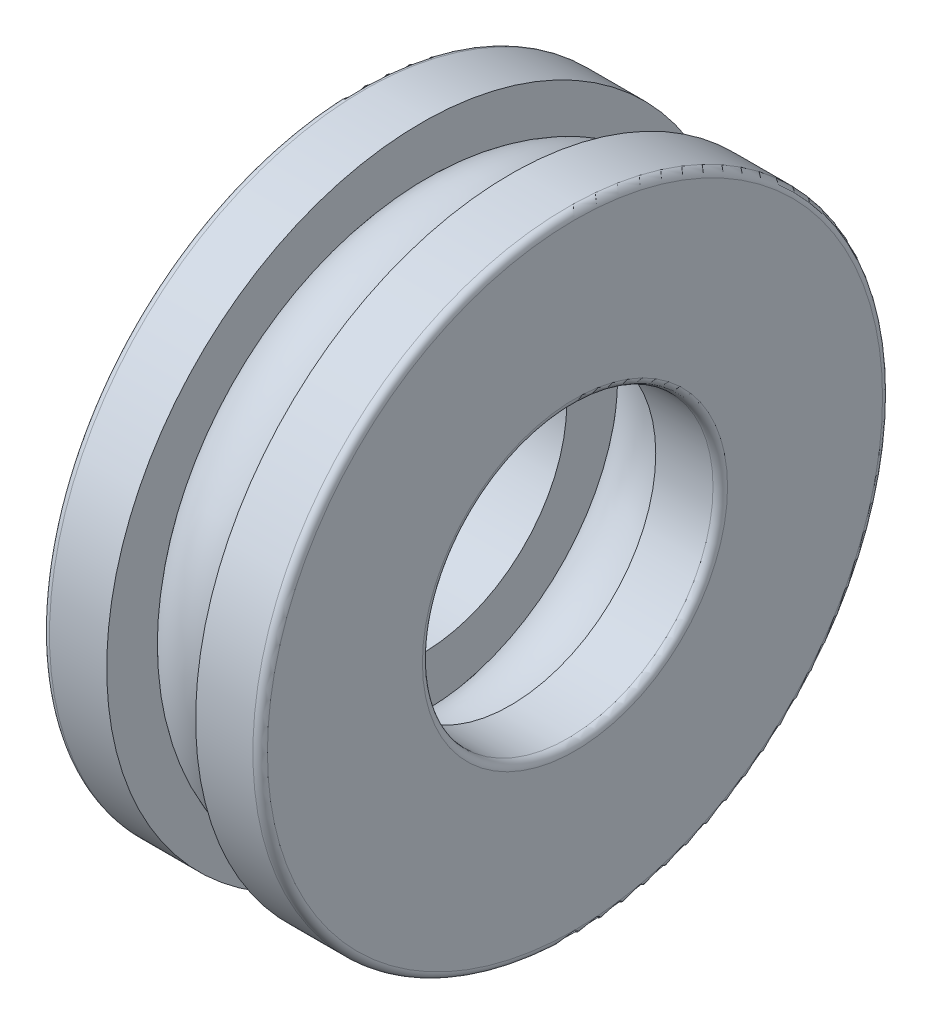
ISO-10303-21;
HEADER;
FILE_DESCRIPTION(('STEP AP214'),'2;1');
FILE_NAME('part.step','',(''),(''),'','','');
FILE_SCHEMA(('AUTOMOTIVE_DESIGN { 1 0 10303 214 1 1 1 1 }'));
ENDSEC;
DATA;
#1=APPLICATION_CONTEXT('core data for automotive mechanical design processes');
#2=APPLICATION_PROTOCOL_DEFINITION('international standard','automotive_design',2000,#1);
#3=PRODUCT_CONTEXT('',#1,'mechanical');
#4=PRODUCT('Part','Part','',(#3));
#5=PRODUCT_RELATED_PRODUCT_CATEGORY('part','',(#4));
#6=PRODUCT_DEFINITION_FORMATION('','',#4);
#7=PRODUCT_DEFINITION_CONTEXT('part definition',#1,'design');
#8=PRODUCT_DEFINITION('design','',#6,#7);
#9=PRODUCT_DEFINITION_SHAPE('','',#8);
#10=(LENGTH_UNIT() NAMED_UNIT(*) SI_UNIT(.MILLI.,.METRE.));
#11=(NAMED_UNIT(*) PLANE_ANGLE_UNIT() SI_UNIT($,.RADIAN.));
#12=(NAMED_UNIT(*) SI_UNIT($,.STERADIAN.) SOLID_ANGLE_UNIT());
#13=UNCERTAINTY_MEASURE_WITH_UNIT(LENGTH_MEASURE(1.E-05),#10,'distance_accuracy_value','');
#14=(GEOMETRIC_REPRESENTATION_CONTEXT(3) GLOBAL_UNCERTAINTY_ASSIGNED_CONTEXT((#13)) GLOBAL_UNIT_ASSIGNED_CONTEXT((#10,
#11,#12)) REPRESENTATION_CONTEXT('',''));
#15=CARTESIAN_POINT('',(0.,0.,0.));
#16=DIRECTION('',(0.,0.,1.));
#17=DIRECTION('',(1.,0.,0.));
#18=AXIS2_PLACEMENT_3D('',#15,#16,#17);
#19=CARTESIAN_POINT('',(0.,0.,0.));
#20=DIRECTION('',(-1.,0.,0.));
#21=DIRECTION('',(0.,0.,1.));
#22=AXIS2_PLACEMENT_3D('',#19,#20,#21);
#23=TOROIDAL_SURFACE('',#22,9.5,2.295);
#24=CARTESIAN_POINT('',(1.836,0.,0.));
#25=DIRECTION('',(-1.,0.,0.));
#26=DIRECTION('',(0.,0.,1.));
#27=AXIS2_PLACEMENT_3D('',#24,#25,#26);
#28=CIRCLE('',#27,10.877);
#29=CARTESIAN_POINT('',(1.836,0.,10.877));
#30=VERTEX_POINT('',#29);
#31=EDGE_CURVE('E36',#30,#30,#28,.T.);
#32=ORIENTED_EDGE('',*,*,#31,.T.);
#33=EDGE_LOOP('',(#32));
#34=FACE_BOUND('',#33,.T.);
#35=CARTESIAN_POINT('',(-1.836,0.,0.));
#36=DIRECTION('',(1.,0.,0.));
#37=DIRECTION('',(0.,0.,-1.));
#38=AXIS2_PLACEMENT_3D('',#35,#36,#37);
#39=CIRCLE('',#38,10.877);
#40=CARTESIAN_POINT('',(-1.836,0.,-10.877));
#41=VERTEX_POINT('',#40);
#42=EDGE_CURVE('E51',#41,#41,#39,.F.);
#43=ORIENTED_EDGE('',*,*,#42,.F.);
#44=EDGE_LOOP('',(#43));
#45=FACE_BOUND('',#44,.T.);
#46=ADVANCED_FACE('F32',(#34,#45),#23,.T.);
#47=CARTESIAN_POINT('',(-1.836,8.16508277410171,0.));
#48=DIRECTION('',(1.,0.,0.));
#49=DIRECTION('',(0.,0.,-1.));
#50=AXIS2_PLACEMENT_3D('',#47,#48,#49);
#51=PLANE('',#50);
#52=CARTESIAN_POINT('',(-1.836,0.,0.));
#53=DIRECTION('',(1.,0.,0.));
#54=DIRECTION('',(0.,0.,-1.));
#55=AXIS2_PLACEMENT_3D('',#52,#53,#54);
#56=CIRCLE('',#55,6.);
#57=CARTESIAN_POINT('',(-1.836,0.,-6.));
#58=VERTEX_POINT('',#57);
#59=EDGE_CURVE('E70',#58,#58,#56,.T.);
#60=ORIENTED_EDGE('',*,*,#59,.F.);
#61=EDGE_LOOP('',(#60));
#62=FACE_BOUND('',#61,.T.);
#63=CARTESIAN_POINT('',(-1.836,0.,0.));
#64=DIRECTION('',(-1.,0.,0.));
#65=DIRECTION('',(0.,0.,1.));
#66=AXIS2_PLACEMENT_3D('',#63,#64,#65);
#67=CIRCLE('',#66,8.123);
#68=CARTESIAN_POINT('',(-1.836,0.,8.123));
#69=VERTEX_POINT('',#68);
#70=EDGE_CURVE('E49',#69,#69,#67,.F.);
#71=ORIENTED_EDGE('',*,*,#70,.T.);
#72=EDGE_LOOP('',(#71));
#73=FACE_BOUND('',#72,.T.);
#74=ADVANCED_FACE('F99',(#62,#73),#51,.T.);
#75=CARTESIAN_POINT('',(-1.836,13.,0.));
#76=DIRECTION('',(1.,0.,0.));
#77=DIRECTION('',(0.,0.,-1.));
#78=AXIS2_PLACEMENT_3D('',#75,#76,#77);
#79=PLANE('',#78);
#80=ORIENTED_EDGE('',*,*,#42,.T.);
#81=EDGE_LOOP('',(#80));
#82=FACE_BOUND('',#81,.T.);
#83=CARTESIAN_POINT('',(-1.836,0.,0.));
#84=DIRECTION('',(1.,0.,0.));
#85=DIRECTION('',(0.,0.,-1.));
#86=AXIS2_PLACEMENT_3D('',#83,#84,#85);
#87=CIRCLE('',#86,13.);
#88=CARTESIAN_POINT('',(-1.836,0.,-13.));
#89=VERTEX_POINT('',#88);
#90=EDGE_CURVE('E10',#89,#89,#87,.T.);
#91=ORIENTED_EDGE('',*,*,#90,.T.);
#92=EDGE_LOOP('',(#91));
#93=FACE_BOUND('',#92,.T.);
#94=ADVANCED_FACE('F34',(#82,#93),#79,.T.);
#95=CARTESIAN_POINT('',(-34.925,0.,0.));
#96=DIRECTION('',(1.,0.,0.));
#97=DIRECTION('',(0.,0.,-1.));
#98=AXIS2_PLACEMENT_3D('',#95,#96,#97);
#99=CYLINDRICAL_SURFACE('',#98,13.);
#100=CARTESIAN_POINT('',(-4.2,0.,0.));
#101=DIRECTION('',(1.,0.,0.));
#102=DIRECTION('',(0.,0.,-1.));
#103=AXIS2_PLACEMENT_3D('',#100,#101,#102);
#104=CIRCLE('',#103,13.);
#105=CARTESIAN_POINT('',(-4.2,0.,-13.));
#106=VERTEX_POINT('',#105);
#107=EDGE_CURVE('E40',#106,#106,#104,.T.);
#108=ORIENTED_EDGE('',*,*,#107,.T.);
#109=EDGE_LOOP('',(#108));
#110=FACE_BOUND('',#109,.T.);
#111=ORIENTED_EDGE('',*,*,#90,.F.);
#112=EDGE_LOOP('',(#111));
#113=FACE_BOUND('',#112,.T.);
#114=ADVANCED_FACE('F96',(#110,#113),#99,.T.);
#115=CARTESIAN_POINT('',(-4.2,0.,0.));
#116=DIRECTION('',(1.,0.,0.));
#117=DIRECTION('',(0.,0.,-1.));
#118=AXIS2_PLACEMENT_3D('',#115,#116,#117);
#119=TOROIDAL_SURFACE('',#118,12.7,0.300000000000001);
#120=CARTESIAN_POINT('',(-4.5,0.,0.));
#121=DIRECTION('',(1.,0.,0.));
#122=DIRECTION('',(0.,0.,-1.));
#123=AXIS2_PLACEMENT_3D('',#120,#121,#122);
#124=CIRCLE('',#123,12.7);
#125=CARTESIAN_POINT('',(-4.5,0.,-12.7));
#126=VERTEX_POINT('',#125);
#127=EDGE_CURVE('E45',#126,#126,#124,.T.);
#128=ORIENTED_EDGE('',*,*,#127,.T.);
#129=EDGE_LOOP('',(#128));
#130=FACE_BOUND('',#129,.T.);
#131=ORIENTED_EDGE('',*,*,#107,.F.);
#132=EDGE_LOOP('',(#131));
#133=FACE_BOUND('',#132,.T.);
#134=ADVANCED_FACE('F81',(#130,#133),#119,.T.);
#135=CARTESIAN_POINT('',(-4.5,6.3,0.));
#136=DIRECTION('',(-1.,0.,0.));
#137=DIRECTION('',(0.,0.,1.));
#138=AXIS2_PLACEMENT_3D('',#135,#136,#137);
#139=PLANE('',#138);
#140=CARTESIAN_POINT('',(-4.5,0.,0.));
#141=DIRECTION('',(1.,0.,0.));
#142=DIRECTION('',(0.,0.,-1.));
#143=AXIS2_PLACEMENT_3D('',#140,#141,#142);
#144=CIRCLE('',#143,6.3);
#145=CARTESIAN_POINT('',(-4.5,0.,-6.3));
#146=VERTEX_POINT('',#145);
#147=EDGE_CURVE('E76',#146,#146,#144,.T.);
#148=ORIENTED_EDGE('',*,*,#147,.T.);
#149=EDGE_LOOP('',(#148));
#150=FACE_BOUND('',#149,.T.);
#151=ORIENTED_EDGE('',*,*,#127,.F.);
#152=EDGE_LOOP('',(#151));
#153=FACE_BOUND('',#152,.T.);
#154=ADVANCED_FACE('F84',(#150,#153),#139,.T.);
#155=CARTESIAN_POINT('',(-4.2,0.,0.));
#156=DIRECTION('',(1.,0.,0.));
#157=DIRECTION('',(0.,0.,-1.));
#158=AXIS2_PLACEMENT_3D('',#155,#156,#157);
#159=TOROIDAL_SURFACE('',#158,6.3,0.3);
#160=CARTESIAN_POINT('',(-4.2,0.,0.));
#161=DIRECTION('',(1.,0.,0.));
#162=DIRECTION('',(0.,0.,-1.));
#163=AXIS2_PLACEMENT_3D('',#160,#161,#162);
#164=CIRCLE('',#163,6.);
#165=CARTESIAN_POINT('',(-4.2,0.,-6.));
#166=VERTEX_POINT('',#165);
#167=EDGE_CURVE('E73',#166,#166,#164,.T.);
#168=ORIENTED_EDGE('',*,*,#167,.T.);
#169=EDGE_LOOP('',(#168));
#170=FACE_BOUND('',#169,.T.);
#171=ORIENTED_EDGE('',*,*,#147,.F.);
#172=EDGE_LOOP('',(#171));
#173=FACE_BOUND('',#172,.T.);
#174=ADVANCED_FACE('F86',(#170,#173),#159,.T.);
#175=CARTESIAN_POINT('',(-34.925,0.,0.));
#176=DIRECTION('',(1.,0.,0.));
#177=DIRECTION('',(0.,0.,-1.));
#178=AXIS2_PLACEMENT_3D('',#175,#176,#177);
#179=CYLINDRICAL_SURFACE('',#178,6.);
#180=ORIENTED_EDGE('',*,*,#59,.T.);
#181=EDGE_LOOP('',(#180));
#182=FACE_BOUND('',#181,.T.);
#183=ORIENTED_EDGE('',*,*,#167,.F.);
#184=EDGE_LOOP('',(#183));
#185=FACE_BOUND('',#184,.T.);
#186=ADVANCED_FACE('F93',(#182,#185),#179,.F.);
#187=CARTESIAN_POINT('',(1.836,0.,0.));
#188=DIRECTION('',(1.,0.,0.));
#189=DIRECTION('',(0.,0.,-1.));
#190=AXIS2_PLACEMENT_3D('',#187,#188,#189);
#191=CIRCLE('',#190,8.123);
#192=CARTESIAN_POINT('',(1.836,0.,-8.123));
#193=VERTEX_POINT('',#192);
#194=EDGE_CURVE('E52',#193,#193,#191,.T.);
#195=ORIENTED_EDGE('',*,*,#194,.T.);
#196=EDGE_LOOP('',(#195));
#197=FACE_BOUND('',#196,.T.);
#198=ORIENTED_EDGE('',*,*,#70,.F.);
#199=EDGE_LOOP('',(#198));
#200=FACE_BOUND('',#199,.T.);
#201=ADVANCED_FACE('F102',(#197,#200),#23,.T.);
#202=CARTESIAN_POINT('',(1.836,8.16508277410171,0.));
#203=DIRECTION('',(-1.,0.,0.));
#204=DIRECTION('',(0.,0.,-1.));
#205=AXIS2_PLACEMENT_3D('',#202,#203,#204);
#206=PLANE('',#205);
#207=CARTESIAN_POINT('',(1.836,0.,0.));
#208=DIRECTION('',(1.,0.,0.));
#209=DIRECTION('',(0.,0.,-1.));
#210=AXIS2_PLACEMENT_3D('',#207,#208,#209);
#211=CIRCLE('',#210,6.);
#212=CARTESIAN_POINT('',(1.836,0.,-6.));
#213=VERTEX_POINT('',#212);
#214=EDGE_CURVE('E246',#213,#213,#211,.T.);
#215=ORIENTED_EDGE('',*,*,#214,.T.);
#216=EDGE_LOOP('',(#215));
#217=FACE_BOUND('',#216,.T.);
#218=ORIENTED_EDGE('',*,*,#194,.F.);
#219=EDGE_LOOP('',(#218));
#220=FACE_BOUND('',#219,.T.);
#221=ADVANCED_FACE('F111',(#217,#220),#206,.T.);
#222=CARTESIAN_POINT('',(1.836,13.,0.));
#223=DIRECTION('',(-1.,0.,0.));
#224=DIRECTION('',(0.,0.,-1.));
#225=AXIS2_PLACEMENT_3D('',#222,#223,#224);
#226=PLANE('',#225);
#227=ORIENTED_EDGE('',*,*,#31,.F.);
#228=EDGE_LOOP('',(#227));
#229=FACE_BOUND('',#228,.T.);
#230=CARTESIAN_POINT('',(1.836,0.,0.));
#231=DIRECTION('',(1.,0.,0.));
#232=DIRECTION('',(0.,0.,-1.));
#233=AXIS2_PLACEMENT_3D('',#230,#231,#232);
#234=CIRCLE('',#233,13.);
#235=CARTESIAN_POINT('',(1.836,0.,-13.));
#236=VERTEX_POINT('',#235);
#237=EDGE_CURVE('E54',#236,#236,#234,.T.);
#238=ORIENTED_EDGE('',*,*,#237,.F.);
#239=EDGE_LOOP('',(#238));
#240=FACE_BOUND('',#239,.T.);
#241=ADVANCED_FACE('F116',(#229,#240),#226,.T.);
#242=CARTESIAN_POINT('',(34.925,0.,0.));
#243=DIRECTION('',(-1.,0.,0.));
#244=DIRECTION('',(0.,0.,-1.));
#245=AXIS2_PLACEMENT_3D('',#242,#243,#244);
#246=CYLINDRICAL_SURFACE('',#245,13.);
#247=CARTESIAN_POINT('',(4.2,0.,0.));
#248=DIRECTION('',(1.,0.,0.));
#249=DIRECTION('',(0.,0.,-1.));
#250=AXIS2_PLACEMENT_3D('',#247,#248,#249);
#251=CIRCLE('',#250,13.);
#252=CARTESIAN_POINT('',(4.2,0.,-13.));
#253=VERTEX_POINT('',#252);
#254=EDGE_CURVE('E59',#253,#253,#251,.T.);
#255=ORIENTED_EDGE('',*,*,#254,.F.);
#256=EDGE_LOOP('',(#255));
#257=FACE_BOUND('',#256,.T.);
#258=ORIENTED_EDGE('',*,*,#237,.T.);
#259=EDGE_LOOP('',(#258));
#260=FACE_BOUND('',#259,.T.);
#261=ADVANCED_FACE('F190',(#257,#260),#246,.T.);
#262=CARTESIAN_POINT('',(4.2,0.,0.));
#263=DIRECTION('',(-1.,0.,0.));
#264=DIRECTION('',(0.,0.,-1.));
#265=AXIS2_PLACEMENT_3D('',#262,#263,#264);
#266=TOROIDAL_SURFACE('',#265,12.7,0.300000000000001);
#267=CARTESIAN_POINT('',(4.5,0.,0.));
#268=DIRECTION('',(1.,0.,0.));
#269=DIRECTION('',(0.,0.,-1.));
#270=AXIS2_PLACEMENT_3D('',#267,#268,#269);
#271=CIRCLE('',#270,12.7);
#272=CARTESIAN_POINT('',(4.5,0.,-12.7));
#273=VERTEX_POINT('',#272);
#274=EDGE_CURVE('E64',#273,#273,#271,.T.);
#275=ORIENTED_EDGE('',*,*,#274,.F.);
#276=EDGE_LOOP('',(#275));
#277=FACE_BOUND('',#276,.T.);
#278=ORIENTED_EDGE('',*,*,#254,.T.);
#279=EDGE_LOOP('',(#278));
#280=FACE_BOUND('',#279,.T.);
#281=ADVANCED_FACE('F198',(#277,#280),#266,.T.);
#282=CARTESIAN_POINT('',(4.5,6.3,0.));
#283=DIRECTION('',(1.,0.,0.));
#284=DIRECTION('',(0.,0.,1.));
#285=AXIS2_PLACEMENT_3D('',#282,#283,#284);
#286=PLANE('',#285);
#287=CARTESIAN_POINT('',(4.5,0.,0.));
#288=DIRECTION('',(1.,0.,0.));
#289=DIRECTION('',(0.,0.,-1.));
#290=AXIS2_PLACEMENT_3D('',#287,#288,#289);
#291=CIRCLE('',#290,6.3);
#292=CARTESIAN_POINT('',(4.5,0.,-6.3));
#293=VERTEX_POINT('',#292);
#294=EDGE_CURVE('E250',#293,#293,#291,.T.);
#295=ORIENTED_EDGE('',*,*,#294,.F.);
#296=EDGE_LOOP('',(#295));
#297=FACE_BOUND('',#296,.T.);
#298=ORIENTED_EDGE('',*,*,#274,.T.);
#299=EDGE_LOOP('',(#298));
#300=FACE_BOUND('',#299,.T.);
#301=ADVANCED_FACE('F207',(#297,#300),#286,.T.);
#302=CARTESIAN_POINT('',(4.2,0.,0.));
#303=DIRECTION('',(-1.,0.,0.));
#304=DIRECTION('',(0.,0.,-1.));
#305=AXIS2_PLACEMENT_3D('',#302,#303,#304);
#306=TOROIDAL_SURFACE('',#305,6.3,0.3);
#307=CARTESIAN_POINT('',(4.2,0.,0.));
#308=DIRECTION('',(1.,0.,0.));
#309=DIRECTION('',(0.,0.,-1.));
#310=AXIS2_PLACEMENT_3D('',#307,#308,#309);
#311=CIRCLE('',#310,6.);
#312=CARTESIAN_POINT('',(4.2,0.,-6.));
#313=VERTEX_POINT('',#312);
#314=EDGE_CURVE('E249',#313,#313,#311,.T.);
#315=ORIENTED_EDGE('',*,*,#314,.F.);
#316=EDGE_LOOP('',(#315));
#317=FACE_BOUND('',#316,.T.);
#318=ORIENTED_EDGE('',*,*,#294,.T.);
#319=EDGE_LOOP('',(#318));
#320=FACE_BOUND('',#319,.T.);
#321=ADVANCED_FACE('F216',(#317,#320),#306,.T.);
#322=CARTESIAN_POINT('',(34.925,0.,0.));
#323=DIRECTION('',(-1.,0.,0.));
#324=DIRECTION('',(0.,0.,-1.));
#325=AXIS2_PLACEMENT_3D('',#322,#323,#324);
#326=CYLINDRICAL_SURFACE('',#325,6.);
#327=ORIENTED_EDGE('',*,*,#214,.F.);
#328=EDGE_LOOP('',(#327));
#329=FACE_BOUND('',#328,.T.);
#330=ORIENTED_EDGE('',*,*,#314,.T.);
#331=EDGE_LOOP('',(#330));
#332=FACE_BOUND('',#331,.T.);
#333=ADVANCED_FACE('F225',(#329,#332),#326,.F.);
#334=CLOSED_SHELL('',(#46,#74,#94,#114,#134,#154,#174,#186,#201,#221,#241,#261,#281,#301,#321,#333));
#335=MANIFOLD_SOLID_BREP('B2',#334);
#336=ADVANCED_BREP_SHAPE_REPRESENTATION('',(#18,#335),#14);
#337=SHAPE_DEFINITION_REPRESENTATION(#9,#336);
ENDSEC;
END-ISO-10303-21;
